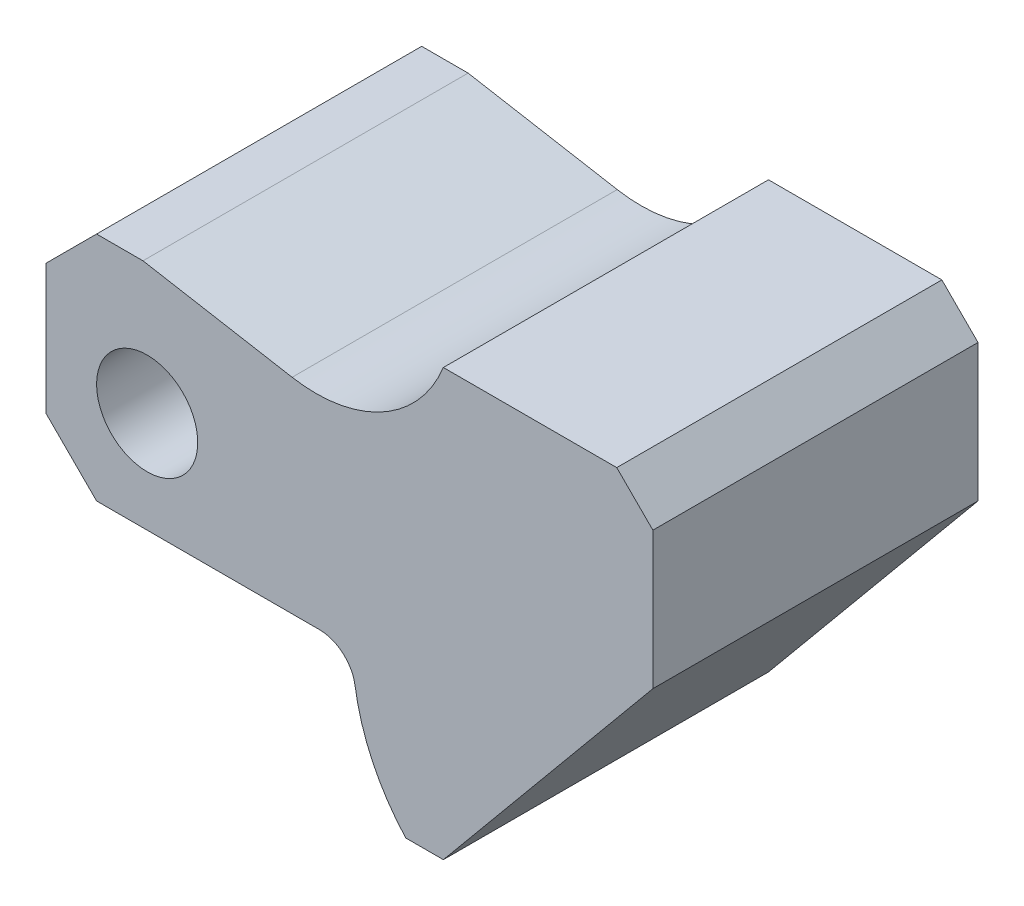
ISO-10303-21;
HEADER;
FILE_DESCRIPTION(('STEP AP214'),'2;1');
FILE_NAME('part.step','',(''),(''),'','','');
FILE_SCHEMA(('AUTOMOTIVE_DESIGN { 1 0 10303 214 1 1 1 1 }'));
ENDSEC;
DATA;
#1=APPLICATION_CONTEXT('core data for automotive mechanical design processes');
#2=APPLICATION_PROTOCOL_DEFINITION('international standard','automotive_design',2000,#1);
#3=PRODUCT_CONTEXT('',#1,'mechanical');
#4=PRODUCT('Part','Part','',(#3));
#5=PRODUCT_RELATED_PRODUCT_CATEGORY('part','',(#4));
#6=PRODUCT_DEFINITION_FORMATION('','',#4);
#7=PRODUCT_DEFINITION_CONTEXT('part definition',#1,'design');
#8=PRODUCT_DEFINITION('design','',#6,#7);
#9=PRODUCT_DEFINITION_SHAPE('','',#8);
#10=(LENGTH_UNIT() NAMED_UNIT(*) SI_UNIT(.MILLI.,.METRE.));
#11=(NAMED_UNIT(*) PLANE_ANGLE_UNIT() SI_UNIT($,.RADIAN.));
#12=(NAMED_UNIT(*) SI_UNIT($,.STERADIAN.) SOLID_ANGLE_UNIT());
#13=UNCERTAINTY_MEASURE_WITH_UNIT(LENGTH_MEASURE(1.E-05),#10,'distance_accuracy_value','');
#14=(GEOMETRIC_REPRESENTATION_CONTEXT(3) GLOBAL_UNCERTAINTY_ASSIGNED_CONTEXT((#13)) GLOBAL_UNIT_ASSIGNED_CONTEXT((#10,
#11,#12)) REPRESENTATION_CONTEXT('',''));
#15=CARTESIAN_POINT('',(0.,0.,0.));
#16=DIRECTION('',(0.,0.,1.));
#17=DIRECTION('',(1.,0.,0.));
#18=AXIS2_PLACEMENT_3D('',#15,#16,#17);
#19=CARTESIAN_POINT('',(30.3649852417781,47.071510056367,45.));
#20=DIRECTION('',(0.,0.,-1.));
#21=DIRECTION('',(-1.,0.,0.));
#22=AXIS2_PLACEMENT_3D('',#19,#20,#21);
#23=PLANE('',#22);
#24=DIRECTION('',(1.,0.,0.));
#25=VECTOR('',#24,1.);
#26=CARTESIAN_POINT('',(30.834436170471,0.,45.));
#27=LINE('',#26,#25);
#28=CARTESIAN_POINT('',(0.,0.,45.));
#29=VERTEX_POINT('',#28);
#30=CARTESIAN_POINT('',(30.834436170471,0.,45.));
#31=VERTEX_POINT('',#30);
#32=EDGE_CURVE('E220',#29,#31,#27,.T.);
#33=ORIENTED_EDGE('',*,*,#32,.T.);
#34=CARTESIAN_POINT('',(30.834436170471,-5.,45.));
#35=DIRECTION('',(0.,0.,-1.));
#36=DIRECTION('',(1.,0.,0.));
#37=AXIS2_PLACEMENT_3D('',#34,#35,#36);
#38=CIRCLE('',#37,5.);
#39=CARTESIAN_POINT('',(35.7777045565228,-4.24893564625904,45.));
#40=VERTEX_POINT('',#39);
#41=EDGE_CURVE('E120',#31,#40,#38,.T.);
#42=ORIENTED_EDGE('',*,*,#41,.T.);
#43=CARTESIAN_POINT('',(63.7428571428572,2.87460810953675E-13,45.));
#44=DIRECTION('',(0.,0.,1.));
#45=DIRECTION('',(-1.,0.,0.));
#46=AXIS2_PLACEMENT_3D('',#43,#44,#45);
#47=CIRCLE('',#46,28.2860957592775);
#48=CARTESIAN_POINT('',(42.788067396763,-18.9999999999997,45.));
#49=VERTEX_POINT('',#48);
#50=EDGE_CURVE('E265',#40,#49,#47,.T.);
#51=ORIENTED_EDGE('',*,*,#50,.T.);
#52=DIRECTION('',(1.,0.,0.));
#53=VECTOR('',#52,1.);
#54=CARTESIAN_POINT('',(48.,-18.9999999999997,45.));
#55=LINE('',#54,#53);
#56=CARTESIAN_POINT('',(48.,-18.9999999999997,45.));
#57=VERTEX_POINT('',#56);
#58=EDGE_CURVE('E285',#49,#57,#55,.T.);
#59=ORIENTED_EDGE('',*,*,#58,.T.);
#60=DIRECTION('',(0.638017864750323,0.770021560905562,0.));
#61=VECTOR('',#60,1.);
#62=CARTESIAN_POINT('',(77.,16.0000000000003,45.));
#63=LINE('',#62,#61);
#64=CARTESIAN_POINT('',(77.,16.0000000000003,45.));
#65=VERTEX_POINT('',#64);
#66=EDGE_CURVE('E281',#57,#65,#63,.T.);
#67=ORIENTED_EDGE('',*,*,#66,.T.);
#68=DIRECTION('',(0.,1.,0.));
#69=VECTOR('',#68,1.);
#70=CARTESIAN_POINT('',(77.,35.0000000000003,45.));
#71=LINE('',#70,#69);
#72=CARTESIAN_POINT('',(77.,35.0000000000003,45.));
#73=VERTEX_POINT('',#72);
#74=EDGE_CURVE('E284',#65,#73,#71,.T.);
#75=ORIENTED_EDGE('',*,*,#74,.T.);
#76=DIRECTION('',(-0.707106781186547,0.707106781186547,0.));
#77=VECTOR('',#76,1.);
#78=CARTESIAN_POINT('',(72.,40.0000000000003,45.));
#79=LINE('',#78,#77);
#80=CARTESIAN_POINT('',(72.,40.0000000000003,45.));
#81=VERTEX_POINT('',#80);
#82=EDGE_CURVE('E289',#73,#81,#79,.T.);
#83=ORIENTED_EDGE('',*,*,#82,.T.);
#84=DIRECTION('',(-1.,0.,0.));
#85=VECTOR('',#84,1.);
#86=CARTESIAN_POINT('',(48.,40.0000000000003,45.));
#87=LINE('',#86,#85);
#88=CARTESIAN_POINT('',(48.,40.0000000000003,45.));
#89=VERTEX_POINT('',#88);
#90=EDGE_CURVE('E296',#81,#89,#87,.T.);
#91=ORIENTED_EDGE('',*,*,#90,.T.);
#92=CARTESIAN_POINT('',(30.3649852417781,47.071510056367,45.));
#93=DIRECTION('',(0.,0.,-1.));
#94=DIRECTION('',(-1.,0.,0.));
#95=AXIS2_PLACEMENT_3D('',#92,#93,#94);
#96=CIRCLE('',#95,19.);
#97=CARTESIAN_POINT('',(27.0656698661065,28.3601627491351,45.));
#98=VERTEX_POINT('',#97);
#99=EDGE_CURVE('E299',#89,#98,#96,.T.);
#100=ORIENTED_EDGE('',*,*,#99,.T.);
#101=DIRECTION('',(-0.984807753012208,0.173648177666929,0.));
#102=VECTOR('',#101,1.);
#103=CARTESIAN_POINT('',(6.42312703890897,32.,45.));
#104=LINE('',#103,#102);
#105=CARTESIAN_POINT('',(6.42312703890897,32.,45.));
#106=VERTEX_POINT('',#105);
#107=EDGE_CURVE('E302',#98,#106,#104,.T.);
#108=ORIENTED_EDGE('',*,*,#107,.T.);
#109=DIRECTION('',(-1.,0.,0.));
#110=VECTOR('',#109,1.);
#111=CARTESIAN_POINT('',(0.,32.,45.));
#112=LINE('',#111,#110);
#113=CARTESIAN_POINT('',(0.,32.,45.));
#114=VERTEX_POINT('',#113);
#115=EDGE_CURVE('E157',#106,#114,#112,.T.);
#116=ORIENTED_EDGE('',*,*,#115,.T.);
#117=DIRECTION('',(-0.707106781186546,-0.707106781186549,0.));
#118=VECTOR('',#117,1.);
#119=CARTESIAN_POINT('',(-7.,25.,45.));
#120=LINE('',#119,#118);
#121=CARTESIAN_POINT('',(-7.,25.,45.));
#122=VERTEX_POINT('',#121);
#123=EDGE_CURVE('E151',#114,#122,#120,.T.);
#124=ORIENTED_EDGE('',*,*,#123,.T.);
#125=DIRECTION('',(0.,-1.,0.));
#126=VECTOR('',#125,1.);
#127=CARTESIAN_POINT('',(-7.,6.99999999999997,45.));
#128=LINE('',#127,#126);
#129=CARTESIAN_POINT('',(-7.,6.99999999999997,45.));
#130=VERTEX_POINT('',#129);
#131=EDGE_CURVE('E155',#122,#130,#128,.T.);
#132=ORIENTED_EDGE('',*,*,#131,.T.);
#133=DIRECTION('',(0.707106781186549,-0.707106781186546,0.));
#134=VECTOR('',#133,1.);
#135=CARTESIAN_POINT('',(0.,0.,45.));
#136=LINE('',#135,#134);
#137=EDGE_CURVE('E59',#130,#29,#136,.T.);
#138=ORIENTED_EDGE('',*,*,#137,.T.);
#139=EDGE_LOOP('',(#33,#42,#51,#59,#67,#75,#83,#91,#100,#108,#116,#124,#132,#138));
#140=FACE_BOUND('',#139,.T.);
#141=CARTESIAN_POINT('',(7.,14.,45.));
#142=DIRECTION('',(0.,0.,1.));
#143=DIRECTION('',(1.,0.,0.));
#144=AXIS2_PLACEMENT_3D('',#141,#142,#143);
#145=CIRCLE('',#144,7.);
#146=CARTESIAN_POINT('',(0.,14.,45.));
#147=VERTEX_POINT('',#146);
#148=EDGE_CURVE('E184',#147,#147,#145,.T.);
#149=ORIENTED_EDGE('',*,*,#148,.F.);
#150=EDGE_LOOP('',(#149));
#151=FACE_BOUND('',#150,.T.);
#152=ADVANCED_FACE('F41',(#140,#151),#23,.F.);
#153=CARTESIAN_POINT('',(30.3649852417781,47.071510056367,0.));
#154=DIRECTION('',(0.,0.,-1.));
#155=DIRECTION('',(-1.,0.,0.));
#156=AXIS2_PLACEMENT_3D('',#153,#154,#155);
#157=PLANE('',#156);
#158=DIRECTION('',(1.,0.,0.));
#159=VECTOR('',#158,1.);
#160=CARTESIAN_POINT('',(30.834436170471,0.,0.));
#161=LINE('',#160,#159);
#162=CARTESIAN_POINT('',(0.,0.,0.));
#163=VERTEX_POINT('',#162);
#164=CARTESIAN_POINT('',(30.834436170471,0.,0.));
#165=VERTEX_POINT('',#164);
#166=EDGE_CURVE('E179',#163,#165,#161,.T.);
#167=ORIENTED_EDGE('',*,*,#166,.F.);
#168=DIRECTION('',(0.707106781186549,-0.707106781186546,0.));
#169=VECTOR('',#168,1.);
#170=CARTESIAN_POINT('',(0.,0.,0.));
#171=LINE('',#170,#169);
#172=CARTESIAN_POINT('',(-7.,6.99999999999997,0.));
#173=VERTEX_POINT('',#172);
#174=EDGE_CURVE('E112',#173,#163,#171,.T.);
#175=ORIENTED_EDGE('',*,*,#174,.F.);
#176=DIRECTION('',(0.,-1.,0.));
#177=VECTOR('',#176,1.);
#178=CARTESIAN_POINT('',(-7.,6.99999999999997,0.));
#179=LINE('',#178,#177);
#180=CARTESIAN_POINT('',(-7.,25.,0.));
#181=VERTEX_POINT('',#180);
#182=EDGE_CURVE('E106',#181,#173,#179,.T.);
#183=ORIENTED_EDGE('',*,*,#182,.F.);
#184=DIRECTION('',(-0.707106781186546,-0.707106781186549,0.));
#185=VECTOR('',#184,1.);
#186=CARTESIAN_POINT('',(-7.,25.,0.));
#187=LINE('',#186,#185);
#188=CARTESIAN_POINT('',(0.,32.,0.));
#189=VERTEX_POINT('',#188);
#190=EDGE_CURVE('E166',#189,#181,#187,.T.);
#191=ORIENTED_EDGE('',*,*,#190,.F.);
#192=DIRECTION('',(-1.,0.,0.));
#193=VECTOR('',#192,1.);
#194=CARTESIAN_POINT('',(0.,32.,0.));
#195=LINE('',#194,#193);
#196=CARTESIAN_POINT('',(6.42312703890897,32.,0.));
#197=VERTEX_POINT('',#196);
#198=EDGE_CURVE('E211',#197,#189,#195,.T.);
#199=ORIENTED_EDGE('',*,*,#198,.F.);
#200=DIRECTION('',(-0.984807753012208,0.173648177666929,0.));
#201=VECTOR('',#200,1.);
#202=CARTESIAN_POINT('',(6.42312703890897,32.,0.));
#203=LINE('',#202,#201);
#204=CARTESIAN_POINT('',(27.0656698661065,28.3601627491351,0.));
#205=VERTEX_POINT('',#204);
#206=EDGE_CURVE('E208',#205,#197,#203,.T.);
#207=ORIENTED_EDGE('',*,*,#206,.F.);
#208=CARTESIAN_POINT('',(30.3649852417781,47.071510056367,0.));
#209=DIRECTION('',(0.,0.,-1.));
#210=DIRECTION('',(-1.,0.,0.));
#211=AXIS2_PLACEMENT_3D('',#208,#209,#210);
#212=CIRCLE('',#211,19.);
#213=CARTESIAN_POINT('',(48.,40.0000000000003,0.));
#214=VERTEX_POINT('',#213);
#215=EDGE_CURVE('E205',#214,#205,#212,.T.);
#216=ORIENTED_EDGE('',*,*,#215,.F.);
#217=DIRECTION('',(-1.,0.,0.));
#218=VECTOR('',#217,1.);
#219=CARTESIAN_POINT('',(48.,40.0000000000003,0.));
#220=LINE('',#219,#218);
#221=CARTESIAN_POINT('',(72.,40.0000000000003,0.));
#222=VERTEX_POINT('',#221);
#223=EDGE_CURVE('E202',#222,#214,#220,.T.);
#224=ORIENTED_EDGE('',*,*,#223,.F.);
#225=DIRECTION('',(-0.707106781186547,0.707106781186547,0.));
#226=VECTOR('',#225,1.);
#227=CARTESIAN_POINT('',(72.,40.0000000000003,0.));
#228=LINE('',#227,#226);
#229=CARTESIAN_POINT('',(77.,35.0000000000003,0.));
#230=VERTEX_POINT('',#229);
#231=EDGE_CURVE('E199',#230,#222,#228,.T.);
#232=ORIENTED_EDGE('',*,*,#231,.F.);
#233=DIRECTION('',(0.,1.,0.));
#234=VECTOR('',#233,1.);
#235=CARTESIAN_POINT('',(77.,35.0000000000003,0.));
#236=LINE('',#235,#234);
#237=CARTESIAN_POINT('',(77.,16.0000000000003,0.));
#238=VERTEX_POINT('',#237);
#239=EDGE_CURVE('E196',#238,#230,#236,.T.);
#240=ORIENTED_EDGE('',*,*,#239,.F.);
#241=DIRECTION('',(0.638017864750323,0.770021560905562,0.));
#242=VECTOR('',#241,1.);
#243=CARTESIAN_POINT('',(77.,16.0000000000003,0.));
#244=LINE('',#243,#242);
#245=CARTESIAN_POINT('',(48.,-18.9999999999997,0.));
#246=VERTEX_POINT('',#245);
#247=EDGE_CURVE('E193',#246,#238,#244,.T.);
#248=ORIENTED_EDGE('',*,*,#247,.F.);
#249=DIRECTION('',(1.,0.,0.));
#250=VECTOR('',#249,1.);
#251=CARTESIAN_POINT('',(48.,-18.9999999999997,0.));
#252=LINE('',#251,#250);
#253=CARTESIAN_POINT('',(42.788067396763,-18.9999999999997,0.));
#254=VERTEX_POINT('',#253);
#255=EDGE_CURVE('E190',#254,#246,#252,.T.);
#256=ORIENTED_EDGE('',*,*,#255,.F.);
#257=CARTESIAN_POINT('',(63.7428571428572,2.87460810953675E-13,0.));
#258=DIRECTION('',(0.,0.,1.));
#259=DIRECTION('',(-1.,0.,0.));
#260=AXIS2_PLACEMENT_3D('',#257,#258,#259);
#261=CIRCLE('',#260,28.2860957592775);
#262=CARTESIAN_POINT('',(35.7777045565228,-4.24893564625904,0.));
#263=VERTEX_POINT('',#262);
#264=EDGE_CURVE('E187',#263,#254,#261,.T.);
#265=ORIENTED_EDGE('',*,*,#264,.F.);
#266=CARTESIAN_POINT('',(30.834436170471,-5.,0.));
#267=DIRECTION('',(0.,0.,-1.));
#268=DIRECTION('',(1.,0.,0.));
#269=AXIS2_PLACEMENT_3D('',#266,#267,#268);
#270=CIRCLE('',#269,5.);
#271=EDGE_CURVE('E183',#165,#263,#270,.T.);
#272=ORIENTED_EDGE('',*,*,#271,.F.);
#273=EDGE_LOOP('',(#167,#175,#183,#191,#199,#207,#216,#224,#232,#240,#248,#256,#265,#272));
#274=FACE_BOUND('',#273,.T.);
#275=CARTESIAN_POINT('',(7.,14.,0.));
#276=DIRECTION('',(0.,0.,1.));
#277=DIRECTION('',(1.,0.,0.));
#278=AXIS2_PLACEMENT_3D('',#275,#276,#277);
#279=CIRCLE('',#278,7.);
#280=CARTESIAN_POINT('',(0.,14.,0.));
#281=VERTEX_POINT('',#280);
#282=EDGE_CURVE('E477',#281,#281,#279,.T.);
#283=ORIENTED_EDGE('',*,*,#282,.T.);
#284=EDGE_LOOP('',(#283));
#285=FACE_BOUND('',#284,.T.);
#286=ADVANCED_FACE('F269',(#274,#285),#157,.T.);
#287=CARTESIAN_POINT('',(30.834436170471,0.,45.));
#288=DIRECTION('',(0.,1.,0.));
#289=DIRECTION('',(0.,0.,1.));
#290=AXIS2_PLACEMENT_3D('',#287,#288,#289);
#291=PLANE('',#290);
#292=ORIENTED_EDGE('',*,*,#166,.T.);
#293=DIRECTION('',(0.,0.,-1.));
#294=VECTOR('',#293,1.);
#295=CARTESIAN_POINT('',(30.834436170471,0.,45.));
#296=LINE('',#295,#294);
#297=EDGE_CURVE('E11',#31,#165,#296,.T.);
#298=ORIENTED_EDGE('',*,*,#297,.F.);
#299=ORIENTED_EDGE('',*,*,#32,.F.);
#300=DIRECTION('',(0.,0.,-1.));
#301=VECTOR('',#300,1.);
#302=CARTESIAN_POINT('',(0.,0.,45.));
#303=LINE('',#302,#301);
#304=EDGE_CURVE('E175',#29,#163,#303,.T.);
#305=ORIENTED_EDGE('',*,*,#304,.T.);
#306=EDGE_LOOP('',(#292,#298,#299,#305));
#307=FACE_BOUND('',#306,.T.);
#308=ADVANCED_FACE('F43',(#307),#291,.F.);
#309=CARTESIAN_POINT('',(30.834436170471,-5.,45.));
#310=DIRECTION('',(0.,0.,-1.));
#311=DIRECTION('',(-1.,0.,0.));
#312=AXIS2_PLACEMENT_3D('',#309,#310,#311);
#313=CYLINDRICAL_SURFACE('',#312,5.);
#314=ORIENTED_EDGE('',*,*,#271,.T.);
#315=DIRECTION('',(0.,0.,-1.));
#316=VECTOR('',#315,1.);
#317=CARTESIAN_POINT('',(35.7777045565228,-4.24893564625904,45.));
#318=LINE('',#317,#316);
#319=EDGE_CURVE('E51',#40,#263,#318,.T.);
#320=ORIENTED_EDGE('',*,*,#319,.F.);
#321=ORIENTED_EDGE('',*,*,#41,.F.);
#322=ORIENTED_EDGE('',*,*,#297,.T.);
#323=EDGE_LOOP('',(#314,#320,#321,#322));
#324=FACE_BOUND('',#323,.T.);
#325=ADVANCED_FACE('F338',(#324),#313,.F.);
#326=CARTESIAN_POINT('',(63.7428571428572,2.87460810953675E-13,45.));
#327=DIRECTION('',(0.,0.,-1.));
#328=DIRECTION('',(-1.,0.,0.));
#329=AXIS2_PLACEMENT_3D('',#326,#327,#328);
#330=CYLINDRICAL_SURFACE('',#329,28.2860957592775);
#331=ORIENTED_EDGE('',*,*,#264,.T.);
#332=DIRECTION('',(0.,0.,-1.));
#333=VECTOR('',#332,1.);
#334=CARTESIAN_POINT('',(42.788067396763,-18.9999999999997,45.));
#335=LINE('',#334,#333);
#336=EDGE_CURVE('E255',#49,#254,#335,.T.);
#337=ORIENTED_EDGE('',*,*,#336,.F.);
#338=ORIENTED_EDGE('',*,*,#50,.F.);
#339=ORIENTED_EDGE('',*,*,#319,.T.);
#340=EDGE_LOOP('',(#331,#337,#338,#339));
#341=FACE_BOUND('',#340,.T.);
#342=ADVANCED_FACE('F263',(#341),#330,.T.);
#343=CARTESIAN_POINT('',(48.,-18.9999999999997,45.));
#344=DIRECTION('',(0.,1.,0.));
#345=DIRECTION('',(0.,0.,1.));
#346=AXIS2_PLACEMENT_3D('',#343,#344,#345);
#347=PLANE('',#346);
#348=ORIENTED_EDGE('',*,*,#255,.T.);
#349=DIRECTION('',(0.,0.,-1.));
#350=VECTOR('',#349,1.);
#351=CARTESIAN_POINT('',(48.,-18.9999999999997,45.));
#352=LINE('',#351,#350);
#353=EDGE_CURVE('E251',#57,#246,#352,.T.);
#354=ORIENTED_EDGE('',*,*,#353,.F.);
#355=ORIENTED_EDGE('',*,*,#58,.F.);
#356=ORIENTED_EDGE('',*,*,#336,.T.);
#357=EDGE_LOOP('',(#348,#354,#355,#356));
#358=FACE_BOUND('',#357,.T.);
#359=ADVANCED_FACE('F275',(#358),#347,.F.);
#360=CARTESIAN_POINT('',(77.,16.0000000000003,45.));
#361=DIRECTION('',(-0.770021560905562,0.638017864750323,0.));
#362=DIRECTION('',(-0.638017864750323,-0.770021560905562,0.));
#363=AXIS2_PLACEMENT_3D('',#360,#361,#362);
#364=PLANE('',#363);
#365=ORIENTED_EDGE('',*,*,#247,.T.);
#366=DIRECTION('',(0.,0.,-1.));
#367=VECTOR('',#366,1.);
#368=CARTESIAN_POINT('',(77.,16.0000000000003,45.));
#369=LINE('',#368,#367);
#370=EDGE_CURVE('E247',#65,#238,#369,.T.);
#371=ORIENTED_EDGE('',*,*,#370,.F.);
#372=ORIENTED_EDGE('',*,*,#66,.F.);
#373=ORIENTED_EDGE('',*,*,#353,.T.);
#374=EDGE_LOOP('',(#365,#371,#372,#373));
#375=FACE_BOUND('',#374,.T.);
#376=ADVANCED_FACE('F279',(#375),#364,.F.);
#377=CARTESIAN_POINT('',(77.,35.0000000000003,45.));
#378=DIRECTION('',(-1.,0.,0.));
#379=DIRECTION('',(0.,0.,1.));
#380=AXIS2_PLACEMENT_3D('',#377,#378,#379);
#381=PLANE('',#380);
#382=ORIENTED_EDGE('',*,*,#239,.T.);
#383=DIRECTION('',(0.,0.,-1.));
#384=VECTOR('',#383,1.);
#385=CARTESIAN_POINT('',(77.,35.0000000000003,45.));
#386=LINE('',#385,#384);
#387=EDGE_CURVE('E243',#73,#230,#386,.T.);
#388=ORIENTED_EDGE('',*,*,#387,.F.);
#389=ORIENTED_EDGE('',*,*,#74,.F.);
#390=ORIENTED_EDGE('',*,*,#370,.T.);
#391=EDGE_LOOP('',(#382,#388,#389,#390));
#392=FACE_BOUND('',#391,.T.);
#393=ADVANCED_FACE('F351',(#392),#381,.F.);
#394=CARTESIAN_POINT('',(72.,40.0000000000003,45.));
#395=DIRECTION('',(-0.707106781186547,-0.707106781186547,0.));
#396=DIRECTION('',(0.707106781186548,-0.707106781186548,0.));
#397=AXIS2_PLACEMENT_3D('',#394,#395,#396);
#398=PLANE('',#397);
#399=ORIENTED_EDGE('',*,*,#231,.T.);
#400=DIRECTION('',(0.,0.,-1.));
#401=VECTOR('',#400,1.);
#402=CARTESIAN_POINT('',(72.,40.0000000000003,45.));
#403=LINE('',#402,#401);
#404=EDGE_CURVE('E239',#81,#222,#403,.T.);
#405=ORIENTED_EDGE('',*,*,#404,.F.);
#406=ORIENTED_EDGE('',*,*,#82,.F.);
#407=ORIENTED_EDGE('',*,*,#387,.T.);
#408=EDGE_LOOP('',(#399,#405,#406,#407));
#409=FACE_BOUND('',#408,.T.);
#410=ADVANCED_FACE('F354',(#409),#398,.F.);
#411=CARTESIAN_POINT('',(48.,40.0000000000003,45.));
#412=DIRECTION('',(0.,-1.,0.));
#413=DIRECTION('',(1.,0.,0.));
#414=AXIS2_PLACEMENT_3D('',#411,#412,#413);
#415=PLANE('',#414);
#416=ORIENTED_EDGE('',*,*,#223,.T.);
#417=DIRECTION('',(0.,0.,-1.));
#418=VECTOR('',#417,1.);
#419=CARTESIAN_POINT('',(48.,40.0000000000003,45.));
#420=LINE('',#419,#418);
#421=EDGE_CURVE('E235',#89,#214,#420,.T.);
#422=ORIENTED_EDGE('',*,*,#421,.F.);
#423=ORIENTED_EDGE('',*,*,#90,.F.);
#424=ORIENTED_EDGE('',*,*,#404,.T.);
#425=EDGE_LOOP('',(#416,#422,#423,#424));
#426=FACE_BOUND('',#425,.T.);
#427=ADVANCED_FACE('F358',(#426),#415,.F.);
#428=CARTESIAN_POINT('',(30.3649852417781,47.071510056367,45.));
#429=DIRECTION('',(0.,0.,-1.));
#430=DIRECTION('',(-1.,0.,0.));
#431=AXIS2_PLACEMENT_3D('',#428,#429,#430);
#432=CYLINDRICAL_SURFACE('',#431,19.);
#433=ORIENTED_EDGE('',*,*,#215,.T.);
#434=DIRECTION('',(0.,0.,-1.));
#435=VECTOR('',#434,1.);
#436=CARTESIAN_POINT('',(27.0656698661065,28.3601627491351,45.));
#437=LINE('',#436,#435);
#438=EDGE_CURVE('E231',#98,#205,#437,.T.);
#439=ORIENTED_EDGE('',*,*,#438,.F.);
#440=ORIENTED_EDGE('',*,*,#99,.F.);
#441=ORIENTED_EDGE('',*,*,#421,.T.);
#442=EDGE_LOOP('',(#433,#439,#440,#441));
#443=FACE_BOUND('',#442,.T.);
#444=ADVANCED_FACE('F362',(#443),#432,.F.);
#445=CARTESIAN_POINT('',(6.42312703890897,32.,45.));
#446=DIRECTION('',(-0.173648177666929,-0.984807753012208,0.));
#447=DIRECTION('',(0.984807753012208,-0.173648177666929,0.));
#448=AXIS2_PLACEMENT_3D('',#445,#446,#447);
#449=PLANE('',#448);
#450=ORIENTED_EDGE('',*,*,#206,.T.);
#451=DIRECTION('',(0.,0.,-1.));
#452=VECTOR('',#451,1.);
#453=CARTESIAN_POINT('',(6.42312703890897,32.,45.));
#454=LINE('',#453,#452);
#455=EDGE_CURVE('E227',#106,#197,#454,.T.);
#456=ORIENTED_EDGE('',*,*,#455,.F.);
#457=ORIENTED_EDGE('',*,*,#107,.F.);
#458=ORIENTED_EDGE('',*,*,#438,.T.);
#459=EDGE_LOOP('',(#450,#456,#457,#458));
#460=FACE_BOUND('',#459,.T.);
#461=ADVANCED_FACE('F310',(#460),#449,.F.);
#462=CARTESIAN_POINT('',(0.,32.,45.));
#463=DIRECTION('',(0.,-1.,0.));
#464=DIRECTION('',(0.,0.,-1.));
#465=AXIS2_PLACEMENT_3D('',#462,#463,#464);
#466=PLANE('',#465);
#467=ORIENTED_EDGE('',*,*,#198,.T.);
#468=DIRECTION('',(0.,0.,-1.));
#469=VECTOR('',#468,1.);
#470=CARTESIAN_POINT('',(0.,32.,45.));
#471=LINE('',#470,#469);
#472=EDGE_CURVE('E168',#114,#189,#471,.T.);
#473=ORIENTED_EDGE('',*,*,#472,.F.);
#474=ORIENTED_EDGE('',*,*,#115,.F.);
#475=ORIENTED_EDGE('',*,*,#455,.T.);
#476=EDGE_LOOP('',(#467,#473,#474,#475));
#477=FACE_BOUND('',#476,.T.);
#478=ADVANCED_FACE('F314',(#477),#466,.F.);
#479=CARTESIAN_POINT('',(-7.,25.,45.));
#480=DIRECTION('',(0.707106781186549,-0.707106781186546,0.));
#481=DIRECTION('',(0.707106781186546,0.707106781186549,0.));
#482=AXIS2_PLACEMENT_3D('',#479,#480,#481);
#483=PLANE('',#482);
#484=ORIENTED_EDGE('',*,*,#190,.T.);
#485=DIRECTION('',(0.,0.,-1.));
#486=VECTOR('',#485,1.);
#487=CARTESIAN_POINT('',(-7.,25.,45.));
#488=LINE('',#487,#486);
#489=EDGE_CURVE('E163',#122,#181,#488,.T.);
#490=ORIENTED_EDGE('',*,*,#489,.F.);
#491=ORIENTED_EDGE('',*,*,#123,.F.);
#492=ORIENTED_EDGE('',*,*,#472,.T.);
#493=EDGE_LOOP('',(#484,#490,#491,#492));
#494=FACE_BOUND('',#493,.T.);
#495=ADVANCED_FACE('F164',(#494),#483,.F.);
#496=CARTESIAN_POINT('',(-7.,6.99999999999997,45.));
#497=DIRECTION('',(1.,0.,0.));
#498=DIRECTION('',(0.,1.,0.));
#499=AXIS2_PLACEMENT_3D('',#496,#497,#498);
#500=PLANE('',#499);
#501=ORIENTED_EDGE('',*,*,#182,.T.);
#502=DIRECTION('',(0.,0.,-1.));
#503=VECTOR('',#502,1.);
#504=CARTESIAN_POINT('',(-7.,6.99999999999997,45.));
#505=LINE('',#504,#503);
#506=EDGE_CURVE('E169',#130,#173,#505,.T.);
#507=ORIENTED_EDGE('',*,*,#506,.F.);
#508=ORIENTED_EDGE('',*,*,#131,.F.);
#509=ORIENTED_EDGE('',*,*,#489,.T.);
#510=EDGE_LOOP('',(#501,#507,#508,#509));
#511=FACE_BOUND('',#510,.T.);
#512=ADVANCED_FACE('F171',(#511),#500,.F.);
#513=CARTESIAN_POINT('',(0.,0.,45.));
#514=DIRECTION('',(0.707106781186546,0.707106781186549,0.));
#515=DIRECTION('',(-0.707106781186549,0.707106781186546,0.));
#516=AXIS2_PLACEMENT_3D('',#513,#514,#515);
#517=PLANE('',#516);
#518=ORIENTED_EDGE('',*,*,#174,.T.);
#519=ORIENTED_EDGE('',*,*,#304,.F.);
#520=ORIENTED_EDGE('',*,*,#137,.F.);
#521=ORIENTED_EDGE('',*,*,#506,.T.);
#522=EDGE_LOOP('',(#518,#519,#520,#521));
#523=FACE_BOUND('',#522,.T.);
#524=ADVANCED_FACE('F318',(#523),#517,.F.);
#525=CARTESIAN_POINT('',(7.,14.,45.));
#526=DIRECTION('',(0.,0.,-1.));
#527=DIRECTION('',(-1.,0.,0.));
#528=AXIS2_PLACEMENT_3D('',#525,#526,#527);
#529=CYLINDRICAL_SURFACE('',#528,7.);
#530=CARTESIAN_POINT('',(0.,14.,45.));
#531=CARTESIAN_POINT('',(0.,14.,44.53125));
#532=CARTESIAN_POINT('',(0.,14.,44.0625));
#533=CARTESIAN_POINT('',(0.,14.,43.125));
#534=CARTESIAN_POINT('',(0.,14.,42.65625));
#535=CARTESIAN_POINT('',(0.,14.,41.71875));
#536=CARTESIAN_POINT('',(0.,14.,41.25));
#537=CARTESIAN_POINT('',(0.,14.,40.3125));
#538=CARTESIAN_POINT('',(0.,14.,39.84375));
#539=CARTESIAN_POINT('',(0.,14.,38.90625));
#540=CARTESIAN_POINT('',(0.,14.,38.4375));
#541=CARTESIAN_POINT('',(0.,14.,37.5));
#542=CARTESIAN_POINT('',(0.,14.,37.03125));
#543=CARTESIAN_POINT('',(0.,14.,36.09375));
#544=CARTESIAN_POINT('',(0.,14.,35.625));
#545=CARTESIAN_POINT('',(0.,14.,34.6875));
#546=CARTESIAN_POINT('',(0.,14.,34.21875));
#547=CARTESIAN_POINT('',(0.,14.,33.28125));
#548=CARTESIAN_POINT('',(0.,14.,32.8125));
#549=CARTESIAN_POINT('',(0.,14.,31.875));
#550=CARTESIAN_POINT('',(0.,14.,31.40625));
#551=CARTESIAN_POINT('',(0.,14.,30.46875));
#552=CARTESIAN_POINT('',(0.,14.,30.));
#553=CARTESIAN_POINT('',(0.,14.,29.0625));
#554=CARTESIAN_POINT('',(0.,14.,28.59375));
#555=CARTESIAN_POINT('',(0.,14.,27.65625));
#556=CARTESIAN_POINT('',(0.,14.,27.1875));
#557=CARTESIAN_POINT('',(0.,14.,26.25));
#558=CARTESIAN_POINT('',(0.,14.,25.78125));
#559=CARTESIAN_POINT('',(0.,14.,24.84375));
#560=CARTESIAN_POINT('',(0.,14.,24.375));
#561=CARTESIAN_POINT('',(0.,14.,23.4375));
#562=CARTESIAN_POINT('',(0.,14.,22.96875));
#563=CARTESIAN_POINT('',(0.,14.,22.03125));
#564=CARTESIAN_POINT('',(0.,14.,21.5625));
#565=CARTESIAN_POINT('',(0.,14.,20.625));
#566=CARTESIAN_POINT('',(0.,14.,20.15625));
#567=CARTESIAN_POINT('',(0.,14.,19.21875));
#568=CARTESIAN_POINT('',(0.,14.,18.75));
#569=CARTESIAN_POINT('',(0.,14.,17.8125));
#570=CARTESIAN_POINT('',(0.,14.,17.34375));
#571=CARTESIAN_POINT('',(0.,14.,16.40625));
#572=CARTESIAN_POINT('',(0.,14.,15.9375));
#573=CARTESIAN_POINT('',(0.,14.,15.));
#574=CARTESIAN_POINT('',(0.,14.,14.53125));
#575=CARTESIAN_POINT('',(0.,14.,13.59375));
#576=CARTESIAN_POINT('',(0.,14.,13.125));
#577=CARTESIAN_POINT('',(0.,14.,12.1875));
#578=CARTESIAN_POINT('',(0.,14.,11.71875));
#579=CARTESIAN_POINT('',(0.,14.,10.78125));
#580=CARTESIAN_POINT('',(0.,14.,10.3125));
#581=CARTESIAN_POINT('',(0.,14.,9.375));
#582=CARTESIAN_POINT('',(0.,14.,8.90625));
#583=CARTESIAN_POINT('',(0.,14.,7.96874999999999));
#584=CARTESIAN_POINT('',(0.,14.,7.5));
#585=CARTESIAN_POINT('',(0.,14.,6.5625));
#586=CARTESIAN_POINT('',(0.,14.,6.09375));
#587=CARTESIAN_POINT('',(0.,14.,5.15625));
#588=CARTESIAN_POINT('',(0.,14.,4.68749999999999));
#589=CARTESIAN_POINT('',(0.,14.,3.74999999999999));
#590=CARTESIAN_POINT('',(0.,14.,3.28124999999999));
#591=CARTESIAN_POINT('',(0.,14.,2.34374999999999));
#592=CARTESIAN_POINT('',(0.,14.,1.87499999999999));
#593=CARTESIAN_POINT('',(0.,14.,0.937499999999992));
#594=CARTESIAN_POINT('',(0.,14.,0.468749999999993));
#595=CARTESIAN_POINT('',(0.,14.,0.));
#596=B_SPLINE_CURVE_WITH_KNOTS('',3,(#530,#531,#532,#533,#534,#535,#536,#537,#538,#539,#540,
#541,#542,#543,#544,#545,#546,#547,#548,#549,#550,#551,#552,#553,#554,#555,#556,#557,#558,#559,
#560,#561,#562,#563,#564,#565,#566,#567,#568,#569,#570,#571,#572,#573,#574,#575,#576,#577,#578,
#579,#580,#581,#582,#583,#584,#585,#586,#587,#588,#589,#590,#591,#592,#593,#594,#595),
.UNSPECIFIED.,.F.,.F.,(4,2,2,2,2,2,2,2,2,2,2,2,2,2,2,2,2,2,2,2,2,2,2,2,2,2,2,2,2,2,2,2,4),(0.,
1.40625,2.8125,4.21875000000001,5.62500000000001,7.03125,8.4375,9.84375000000001,11.25,12.65625,
14.0625,15.46875,16.875,18.28125,19.6875,21.09375,22.5,23.90625,25.3125,26.71875,28.125,
29.53125,30.9375,32.34375,33.75,35.15625,36.5625,37.96875,39.375,40.78125,42.1875,43.59375,45.),.UNSPECIFIED.);
#597=EDGE_CURVE('BSEAM320',#147,#281,#596,.T.);
#598=ORIENTED_EDGE('',*,*,#148,.T.);
#599=ORIENTED_EDGE('',*,*,#282,.F.);
#600=ORIENTED_EDGE('',*,*,#597,.T.);
#601=ORIENTED_EDGE('',*,*,#597,.F.);
#602=EDGE_LOOP('',(#598,#600,#599,#601));
#603=FACE_BOUND('',#602,.T.);
#604=ADVANCED_FACE('F320',(#603),#529,.F.);
#605=CLOSED_SHELL('',(#152,#286,#308,#325,#342,#359,#376,#393,#410,#427,#444,#461,#478,#495,
#512,#524,#604));
#606=MANIFOLD_SOLID_BREP('B2',#605);
#607=ADVANCED_BREP_SHAPE_REPRESENTATION('',(#18,#606),#14);
#608=SHAPE_DEFINITION_REPRESENTATION(#9,#607);
ENDSEC;
END-ISO-10303-21;
